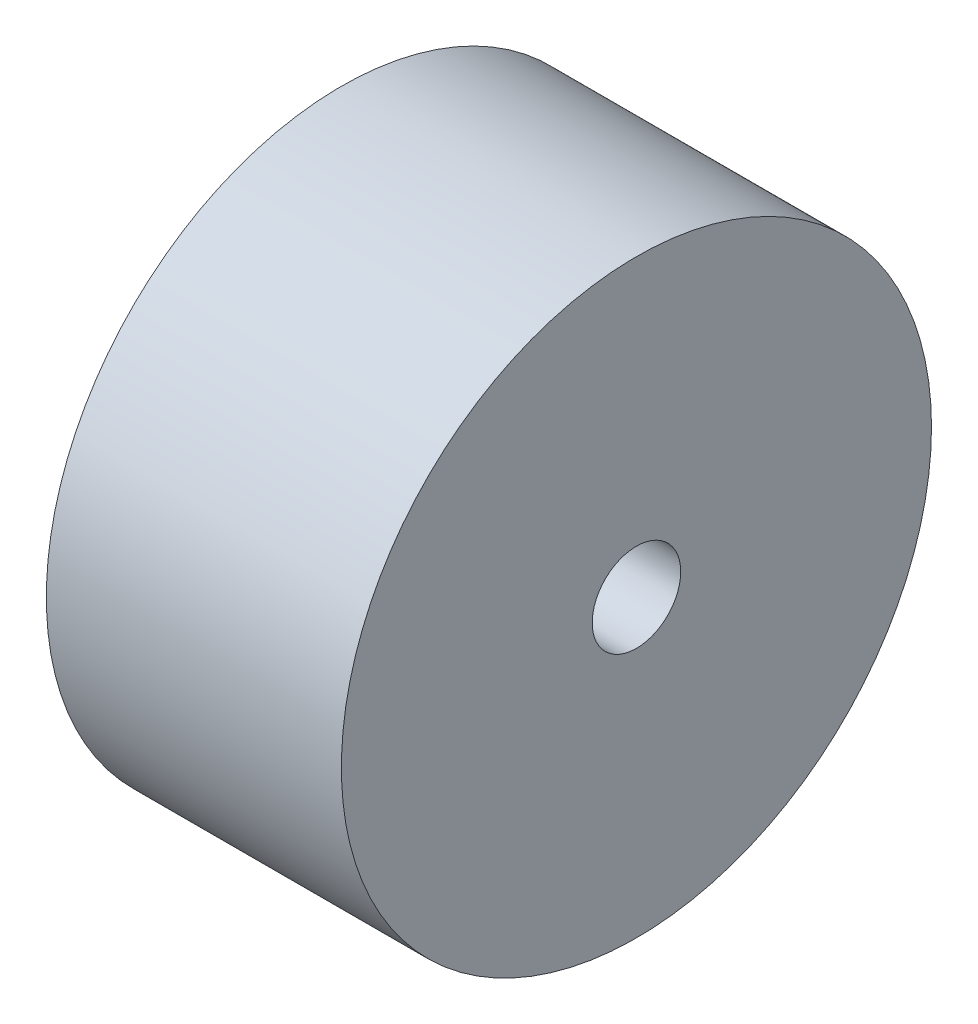
ISO-10303-21;
HEADER;
FILE_DESCRIPTION(('STEP AP214'),'2;1');
FILE_NAME('part.step','',(''),(''),'','','');
FILE_SCHEMA(('AUTOMOTIVE_DESIGN { 1 0 10303 214 1 1 1 1 }'));
ENDSEC;
DATA;
#1=APPLICATION_CONTEXT('core data for automotive mechanical design processes');
#2=APPLICATION_PROTOCOL_DEFINITION('international standard','automotive_design',2000,#1);
#3=PRODUCT_CONTEXT('',#1,'mechanical');
#4=PRODUCT('Part','Part','',(#3));
#5=PRODUCT_RELATED_PRODUCT_CATEGORY('part','',(#4));
#6=PRODUCT_DEFINITION_FORMATION('','',#4);
#7=PRODUCT_DEFINITION_CONTEXT('part definition',#1,'design');
#8=PRODUCT_DEFINITION('design','',#6,#7);
#9=PRODUCT_DEFINITION_SHAPE('','',#8);
#10=(LENGTH_UNIT() NAMED_UNIT(*) SI_UNIT(.MILLI.,.METRE.));
#11=(NAMED_UNIT(*) PLANE_ANGLE_UNIT() SI_UNIT($,.RADIAN.));
#12=(NAMED_UNIT(*) SI_UNIT($,.STERADIAN.) SOLID_ANGLE_UNIT());
#13=UNCERTAINTY_MEASURE_WITH_UNIT(LENGTH_MEASURE(1.E-05),#10,'distance_accuracy_value','');
#14=(GEOMETRIC_REPRESENTATION_CONTEXT(3) GLOBAL_UNCERTAINTY_ASSIGNED_CONTEXT((#13)) GLOBAL_UNIT_ASSIGNED_CONTEXT((#10,
#11,#12)) REPRESENTATION_CONTEXT('',''));
#15=CARTESIAN_POINT('',(0.,0.,0.));
#16=DIRECTION('',(0.,0.,1.));
#17=DIRECTION('',(1.,0.,0.));
#18=AXIS2_PLACEMENT_3D('',#15,#16,#17);
#19=CARTESIAN_POINT('',(20.,0.,0.));
#20=DIRECTION('',(1.,0.,0.));
#21=DIRECTION('',(0.,0.,-1.));
#22=AXIS2_PLACEMENT_3D('',#19,#20,#21);
#23=PLANE('',#22);
#24=CARTESIAN_POINT('',(20.,0.,0.));
#25=DIRECTION('',(1.,0.,0.));
#26=DIRECTION('',(0.,0.,-1.));
#27=AXIS2_PLACEMENT_3D('',#24,#25,#26);
#28=CIRCLE('',#27,20.);
#29=CARTESIAN_POINT('',(20.,0.,-20.));
#30=VERTEX_POINT('',#29);
#31=EDGE_CURVE('E10',#30,#30,#28,.T.);
#32=ORIENTED_EDGE('',*,*,#31,.T.);
#33=EDGE_LOOP('',(#32));
#34=FACE_BOUND('',#33,.T.);
#35=CARTESIAN_POINT('',(20.,0.,0.));
#36=DIRECTION('',(1.,0.,0.));
#37=DIRECTION('',(0.,0.,-1.));
#38=AXIS2_PLACEMENT_3D('',#35,#36,#37);
#39=CIRCLE('',#38,3.);
#40=CARTESIAN_POINT('',(20.,0.,-3.));
#41=VERTEX_POINT('',#40);
#42=EDGE_CURVE('E44',#41,#41,#39,.T.);
#43=ORIENTED_EDGE('',*,*,#42,.F.);
#44=EDGE_LOOP('',(#43));
#45=FACE_BOUND('',#44,.T.);
#46=ADVANCED_FACE('F33',(#34,#45),#23,.T.);
#47=CARTESIAN_POINT('',(0.,0.,0.));
#48=DIRECTION('',(1.,0.,0.));
#49=DIRECTION('',(0.,0.,-1.));
#50=AXIS2_PLACEMENT_3D('',#47,#48,#49);
#51=PLANE('',#50);
#52=CARTESIAN_POINT('',(0.,0.,0.));
#53=DIRECTION('',(1.,0.,0.));
#54=DIRECTION('',(0.,0.,-1.));
#55=AXIS2_PLACEMENT_3D('',#52,#53,#54);
#56=CIRCLE('',#55,20.);
#57=CARTESIAN_POINT('',(0.,0.,-20.));
#58=VERTEX_POINT('',#57);
#59=EDGE_CURVE('E37',#58,#58,#56,.T.);
#60=ORIENTED_EDGE('',*,*,#59,.F.);
#61=EDGE_LOOP('',(#60));
#62=FACE_BOUND('',#61,.T.);
#63=CARTESIAN_POINT('',(0.,0.,0.));
#64=DIRECTION('',(1.,0.,0.));
#65=DIRECTION('',(0.,0.,-1.));
#66=AXIS2_PLACEMENT_3D('',#63,#64,#65);
#67=CIRCLE('',#66,3.);
#68=CARTESIAN_POINT('',(0.,0.,-3.));
#69=VERTEX_POINT('',#68);
#70=EDGE_CURVE('E46',#69,#69,#67,.T.);
#71=ORIENTED_EDGE('',*,*,#70,.T.);
#72=EDGE_LOOP('',(#71));
#73=FACE_BOUND('',#72,.T.);
#74=ADVANCED_FACE('F56',(#62,#73),#51,.F.);
#75=CARTESIAN_POINT('',(20.,0.,0.));
#76=DIRECTION('',(-1.,0.,0.));
#77=DIRECTION('',(0.,0.,1.));
#78=AXIS2_PLACEMENT_3D('',#75,#76,#77);
#79=CYLINDRICAL_SURFACE('',#78,20.);
#80=ORIENTED_EDGE('',*,*,#31,.F.);
#81=EDGE_LOOP('',(#80));
#82=FACE_BOUND('',#81,.T.);
#83=ORIENTED_EDGE('',*,*,#59,.T.);
#84=EDGE_LOOP('',(#83));
#85=FACE_BOUND('',#84,.T.);
#86=ADVANCED_FACE('F35',(#82,#85),#79,.T.);
#87=CARTESIAN_POINT('',(20.,0.,0.));
#88=DIRECTION('',(-1.,0.,0.));
#89=DIRECTION('',(0.,0.,1.));
#90=AXIS2_PLACEMENT_3D('',#87,#88,#89);
#91=CYLINDRICAL_SURFACE('',#90,3.);
#92=ORIENTED_EDGE('',*,*,#42,.T.);
#93=EDGE_LOOP('',(#92));
#94=FACE_BOUND('',#93,.T.);
#95=ORIENTED_EDGE('',*,*,#70,.F.);
#96=EDGE_LOOP('',(#95));
#97=FACE_BOUND('',#96,.T.);
#98=ADVANCED_FACE('F52',(#94,#97),#91,.F.);
#99=CLOSED_SHELL('',(#46,#74,#86,#98));
#100=MANIFOLD_SOLID_BREP('B2',#99);
#101=ADVANCED_BREP_SHAPE_REPRESENTATION('',(#18,#100),#14);
#102=SHAPE_DEFINITION_REPRESENTATION(#9,#101);
ENDSEC;
END-ISO-10303-21;
